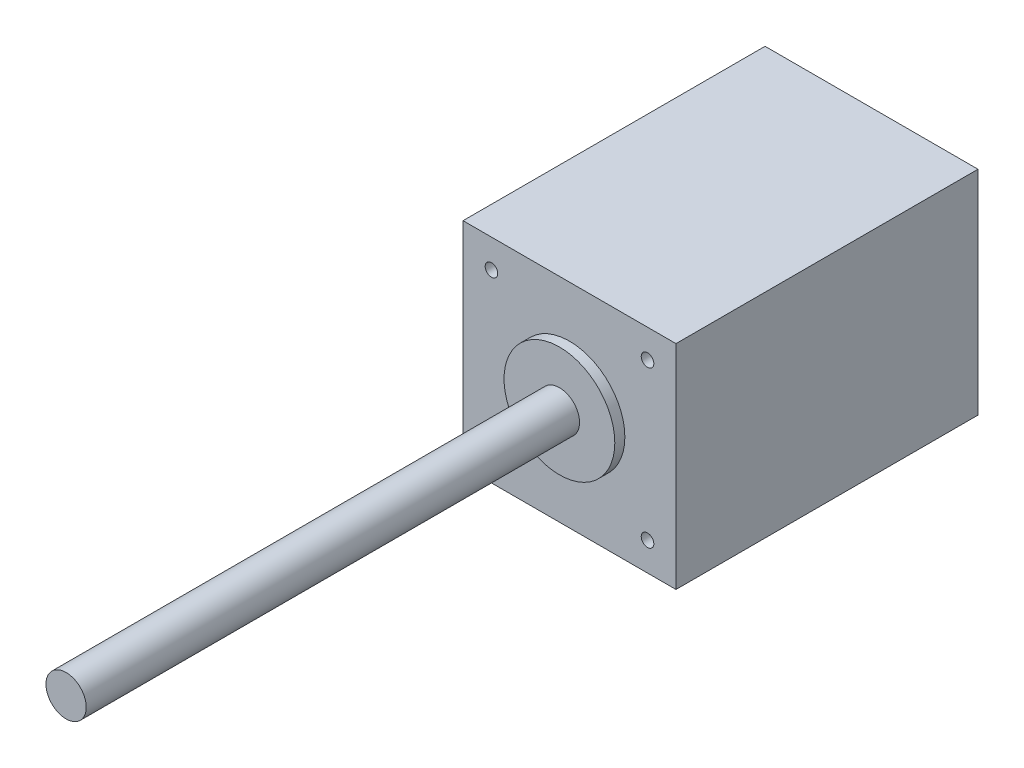
ISO-10303-21;
HEADER;
FILE_DESCRIPTION(('STEP AP214'),'2;1');
FILE_NAME('part.step','',(''),(''),'','','');
FILE_SCHEMA(('AUTOMOTIVE_DESIGN { 1 0 10303 214 1 1 1 1 }'));
ENDSEC;
DATA;
#1=APPLICATION_CONTEXT('core data for automotive mechanical design processes');
#2=APPLICATION_PROTOCOL_DEFINITION('international standard','automotive_design',2000,#1);
#3=PRODUCT_CONTEXT('',#1,'mechanical');
#4=PRODUCT('Part','Part','',(#3));
#5=PRODUCT_RELATED_PRODUCT_CATEGORY('part','',(#4));
#6=PRODUCT_DEFINITION_FORMATION('','',#4);
#7=PRODUCT_DEFINITION_CONTEXT('part definition',#1,'design');
#8=PRODUCT_DEFINITION('design','',#6,#7);
#9=PRODUCT_DEFINITION_SHAPE('','',#8);
#10=(LENGTH_UNIT() NAMED_UNIT(*) SI_UNIT(.MILLI.,.METRE.));
#11=(NAMED_UNIT(*) PLANE_ANGLE_UNIT() SI_UNIT($,.RADIAN.));
#12=(NAMED_UNIT(*) SI_UNIT($,.STERADIAN.) SOLID_ANGLE_UNIT());
#13=UNCERTAINTY_MEASURE_WITH_UNIT(LENGTH_MEASURE(1.E-05),#10,'distance_accuracy_value','');
#14=(GEOMETRIC_REPRESENTATION_CONTEXT(3) GLOBAL_UNCERTAINTY_ASSIGNED_CONTEXT((#13)) GLOBAL_UNIT_ASSIGNED_CONTEXT((#10,
#11,#12)) REPRESENTATION_CONTEXT('',''));
#15=CARTESIAN_POINT('',(0.,0.,0.));
#16=DIRECTION('',(0.,0.,1.));
#17=DIRECTION('',(1.,0.,0.));
#18=AXIS2_PLACEMENT_3D('',#15,#16,#17);
#19=CARTESIAN_POINT('',(-21.15,-21.15,60.));
#20=DIRECTION('',(1.,0.,0.));
#21=DIRECTION('',(0.,0.,-1.));
#22=AXIS2_PLACEMENT_3D('',#19,#20,#21);
#23=PLANE('',#22);
#24=DIRECTION('',(0.,-1.,0.));
#25=VECTOR('',#24,1.);
#26=CARTESIAN_POINT('',(-21.15,-21.15,0.));
#27=LINE('',#26,#25);
#28=CARTESIAN_POINT('',(-21.15,21.15,0.));
#29=VERTEX_POINT('',#28);
#30=CARTESIAN_POINT('',(-21.15,-21.15,0.));
#31=VERTEX_POINT('',#30);
#32=EDGE_CURVE('E116',#29,#31,#27,.T.);
#33=ORIENTED_EDGE('',*,*,#32,.T.);
#34=DIRECTION('',(0.,0.,-1.));
#35=VECTOR('',#34,1.);
#36=CARTESIAN_POINT('',(-21.15,-21.15,60.));
#37=LINE('',#36,#35);
#38=CARTESIAN_POINT('',(-21.15,-21.15,60.));
#39=VERTEX_POINT('',#38);
#40=EDGE_CURVE('E47',#39,#31,#37,.T.);
#41=ORIENTED_EDGE('',*,*,#40,.F.);
#42=DIRECTION('',(0.,-1.,0.));
#43=VECTOR('',#42,1.);
#44=CARTESIAN_POINT('',(-21.15,-21.15,60.));
#45=LINE('',#44,#43);
#46=CARTESIAN_POINT('',(-21.15,21.15,60.));
#47=VERTEX_POINT('',#46);
#48=EDGE_CURVE('E99',#47,#39,#45,.T.);
#49=ORIENTED_EDGE('',*,*,#48,.F.);
#50=DIRECTION('',(0.,0.,-1.));
#51=VECTOR('',#50,1.);
#52=CARTESIAN_POINT('',(-21.15,21.15,60.));
#53=LINE('',#52,#51);
#54=EDGE_CURVE('E112',#47,#29,#53,.T.);
#55=ORIENTED_EDGE('',*,*,#54,.T.);
#56=EDGE_LOOP('',(#33,#41,#49,#55));
#57=FACE_BOUND('',#56,.T.);
#58=ADVANCED_FACE('F44',(#57),#23,.F.);
#59=CARTESIAN_POINT('',(21.15,-21.15,60.));
#60=DIRECTION('',(0.,1.,0.));
#61=DIRECTION('',(-1.,0.,0.));
#62=AXIS2_PLACEMENT_3D('',#59,#60,#61);
#63=PLANE('',#62);
#64=DIRECTION('',(1.,0.,0.));
#65=VECTOR('',#64,1.);
#66=CARTESIAN_POINT('',(21.15,-21.15,0.));
#67=LINE('',#66,#65);
#68=CARTESIAN_POINT('',(21.15,-21.15,0.));
#69=VERTEX_POINT('',#68);
#70=EDGE_CURVE('E105',#31,#69,#67,.T.);
#71=ORIENTED_EDGE('',*,*,#70,.T.);
#72=DIRECTION('',(0.,0.,-1.));
#73=VECTOR('',#72,1.);
#74=CARTESIAN_POINT('',(21.15,-21.15,60.));
#75=LINE('',#74,#73);
#76=CARTESIAN_POINT('',(21.15,-21.15,60.));
#77=VERTEX_POINT('',#76);
#78=EDGE_CURVE('E103',#77,#69,#75,.T.);
#79=ORIENTED_EDGE('',*,*,#78,.F.);
#80=DIRECTION('',(1.,0.,0.));
#81=VECTOR('',#80,1.);
#82=CARTESIAN_POINT('',(21.15,-21.15,60.));
#83=LINE('',#82,#81);
#84=EDGE_CURVE('E94',#39,#77,#83,.T.);
#85=ORIENTED_EDGE('',*,*,#84,.F.);
#86=ORIENTED_EDGE('',*,*,#40,.T.);
#87=EDGE_LOOP('',(#71,#79,#85,#86));
#88=FACE_BOUND('',#87,.T.);
#89=ADVANCED_FACE('F104',(#88),#63,.F.);
#90=CARTESIAN_POINT('',(21.15,-21.15,60.));
#91=DIRECTION('',(-1.,0.,0.));
#92=DIRECTION('',(0.,0.,1.));
#93=AXIS2_PLACEMENT_3D('',#90,#91,#92);
#94=PLANE('',#93);
#95=DIRECTION('',(0.,1.,0.));
#96=VECTOR('',#95,1.);
#97=CARTESIAN_POINT('',(21.15,-21.15,0.));
#98=LINE('',#97,#96);
#99=CARTESIAN_POINT('',(21.15,21.15,0.));
#100=VERTEX_POINT('',#99);
#101=EDGE_CURVE('E80',#69,#100,#98,.T.);
#102=ORIENTED_EDGE('',*,*,#101,.T.);
#103=DIRECTION('',(0.,0.,-1.));
#104=VECTOR('',#103,1.);
#105=CARTESIAN_POINT('',(21.15,21.15,60.));
#106=LINE('',#105,#104);
#107=CARTESIAN_POINT('',(21.15,21.15,60.));
#108=VERTEX_POINT('',#107);
#109=EDGE_CURVE('E107',#108,#100,#106,.T.);
#110=ORIENTED_EDGE('',*,*,#109,.F.);
#111=DIRECTION('',(0.,1.,0.));
#112=VECTOR('',#111,1.);
#113=CARTESIAN_POINT('',(21.15,-21.15,60.));
#114=LINE('',#113,#112);
#115=EDGE_CURVE('E97',#77,#108,#114,.T.);
#116=ORIENTED_EDGE('',*,*,#115,.F.);
#117=ORIENTED_EDGE('',*,*,#78,.T.);
#118=EDGE_LOOP('',(#102,#110,#116,#117));
#119=FACE_BOUND('',#118,.T.);
#120=ADVANCED_FACE('F108',(#119),#94,.F.);
#121=CARTESIAN_POINT('',(21.15,21.15,60.));
#122=DIRECTION('',(0.,-1.,0.));
#123=DIRECTION('',(1.,0.,0.));
#124=AXIS2_PLACEMENT_3D('',#121,#122,#123);
#125=PLANE('',#124);
#126=DIRECTION('',(-1.,0.,0.));
#127=VECTOR('',#126,1.);
#128=CARTESIAN_POINT('',(21.15,21.15,0.));
#129=LINE('',#128,#127);
#130=EDGE_CURVE('E86',#100,#29,#129,.T.);
#131=ORIENTED_EDGE('',*,*,#130,.T.);
#132=ORIENTED_EDGE('',*,*,#54,.F.);
#133=DIRECTION('',(-1.,0.,0.));
#134=VECTOR('',#133,1.);
#135=CARTESIAN_POINT('',(21.15,21.15,60.));
#136=LINE('',#135,#134);
#137=EDGE_CURVE('E63',#108,#47,#136,.T.);
#138=ORIENTED_EDGE('',*,*,#137,.F.);
#139=ORIENTED_EDGE('',*,*,#109,.T.);
#140=EDGE_LOOP('',(#131,#132,#138,#139));
#141=FACE_BOUND('',#140,.T.);
#142=ADVANCED_FACE('F130',(#141),#125,.F.);
#143=CARTESIAN_POINT('',(0.,0.,60.));
#144=DIRECTION('',(0.,0.,1.));
#145=DIRECTION('',(1.,0.,0.));
#146=AXIS2_PLACEMENT_3D('',#143,#144,#145);
#147=PLANE('',#146);
#148=CARTESIAN_POINT('',(-15.5,15.5,60.));
#149=DIRECTION('',(0.,0.,1.));
#150=DIRECTION('',(1.,0.,0.));
#151=AXIS2_PLACEMENT_3D('',#148,#149,#150);
#152=CIRCLE('',#151,1.25);
#153=CARTESIAN_POINT('',(-14.25,15.5,60.));
#154=VERTEX_POINT('',#153);
#155=EDGE_CURVE('E175',#154,#154,#152,.T.);
#156=ORIENTED_EDGE('',*,*,#155,.F.);
#157=EDGE_LOOP('',(#156));
#158=FACE_BOUND('',#157,.T.);
#159=CARTESIAN_POINT('',(15.5,15.5,60.));
#160=DIRECTION('',(0.,0.,1.));
#161=DIRECTION('',(1.,0.,0.));
#162=AXIS2_PLACEMENT_3D('',#159,#160,#161);
#163=CIRCLE('',#162,1.25);
#164=CARTESIAN_POINT('',(16.75,15.5,60.));
#165=VERTEX_POINT('',#164);
#166=EDGE_CURVE('E167',#165,#165,#163,.T.);
#167=ORIENTED_EDGE('',*,*,#166,.F.);
#168=EDGE_LOOP('',(#167));
#169=FACE_BOUND('',#168,.T.);
#170=CARTESIAN_POINT('',(15.5,-15.5,60.));
#171=DIRECTION('',(0.,0.,1.));
#172=DIRECTION('',(1.,0.,0.));
#173=AXIS2_PLACEMENT_3D('',#170,#171,#172);
#174=CIRCLE('',#173,1.25);
#175=CARTESIAN_POINT('',(16.75,-15.5,60.));
#176=VERTEX_POINT('',#175);
#177=EDGE_CURVE('E159',#176,#176,#174,.T.);
#178=ORIENTED_EDGE('',*,*,#177,.F.);
#179=EDGE_LOOP('',(#178));
#180=FACE_BOUND('',#179,.T.);
#181=CARTESIAN_POINT('',(-15.5,-15.5,60.));
#182=DIRECTION('',(0.,0.,1.));
#183=DIRECTION('',(1.,0.,0.));
#184=AXIS2_PLACEMENT_3D('',#181,#182,#183);
#185=CIRCLE('',#184,1.25);
#186=CARTESIAN_POINT('',(-14.25,-15.5,60.));
#187=VERTEX_POINT('',#186);
#188=EDGE_CURVE('E151',#187,#187,#185,.T.);
#189=ORIENTED_EDGE('',*,*,#188,.F.);
#190=EDGE_LOOP('',(#189));
#191=FACE_BOUND('',#190,.T.);
#192=CARTESIAN_POINT('',(0.,0.,60.));
#193=DIRECTION('',(0.,0.,1.));
#194=DIRECTION('',(1.,0.,0.));
#195=AXIS2_PLACEMENT_3D('',#192,#193,#194);
#196=CIRCLE('',#195,11.);
#197=CARTESIAN_POINT('',(11.,0.,60.));
#198=VERTEX_POINT('',#197);
#199=EDGE_CURVE('E54',#198,#198,#196,.T.);
#200=ORIENTED_EDGE('',*,*,#199,.F.);
#201=EDGE_LOOP('',(#200));
#202=FACE_BOUND('',#201,.T.);
#203=ORIENTED_EDGE('',*,*,#48,.T.);
#204=ORIENTED_EDGE('',*,*,#84,.T.);
#205=ORIENTED_EDGE('',*,*,#115,.T.);
#206=ORIENTED_EDGE('',*,*,#137,.T.);
#207=EDGE_LOOP('',(#203,#204,#205,#206));
#208=FACE_BOUND('',#207,.T.);
#209=ADVANCED_FACE('F95',(#158,#169,#180,#191,#202,#208),#147,.T.);
#210=CARTESIAN_POINT('',(0.,0.,0.));
#211=DIRECTION('',(0.,0.,1.));
#212=DIRECTION('',(1.,0.,0.));
#213=AXIS2_PLACEMENT_3D('',#210,#211,#212);
#214=PLANE('',#213);
#215=CARTESIAN_POINT('',(-15.5,15.5,0.));
#216=DIRECTION('',(0.,0.,1.));
#217=DIRECTION('',(1.,0.,0.));
#218=AXIS2_PLACEMENT_3D('',#215,#216,#217);
#219=CIRCLE('',#218,1.24999999999999);
#220=CARTESIAN_POINT('',(-14.25,15.5,0.));
#221=VERTEX_POINT('',#220);
#222=EDGE_CURVE('E171',#221,#221,#219,.T.);
#223=ORIENTED_EDGE('',*,*,#222,.T.);
#224=EDGE_LOOP('',(#223));
#225=FACE_BOUND('',#224,.T.);
#226=CARTESIAN_POINT('',(15.5,15.5,0.));
#227=DIRECTION('',(0.,0.,1.));
#228=DIRECTION('',(1.,0.,0.));
#229=AXIS2_PLACEMENT_3D('',#226,#227,#228);
#230=CIRCLE('',#229,1.24999999999999);
#231=CARTESIAN_POINT('',(16.75,15.5,0.));
#232=VERTEX_POINT('',#231);
#233=EDGE_CURVE('E163',#232,#232,#230,.T.);
#234=ORIENTED_EDGE('',*,*,#233,.T.);
#235=EDGE_LOOP('',(#234));
#236=FACE_BOUND('',#235,.T.);
#237=CARTESIAN_POINT('',(15.5,-15.5,0.));
#238=DIRECTION('',(0.,0.,1.));
#239=DIRECTION('',(1.,0.,0.));
#240=AXIS2_PLACEMENT_3D('',#237,#238,#239);
#241=CIRCLE('',#240,1.24999999999999);
#242=CARTESIAN_POINT('',(16.75,-15.5,0.));
#243=VERTEX_POINT('',#242);
#244=EDGE_CURVE('E155',#243,#243,#241,.T.);
#245=ORIENTED_EDGE('',*,*,#244,.T.);
#246=EDGE_LOOP('',(#245));
#247=FACE_BOUND('',#246,.T.);
#248=CARTESIAN_POINT('',(-15.5,-15.5,0.));
#249=DIRECTION('',(0.,0.,1.));
#250=DIRECTION('',(1.,0.,0.));
#251=AXIS2_PLACEMENT_3D('',#248,#249,#250);
#252=CIRCLE('',#251,1.24999999999999);
#253=CARTESIAN_POINT('',(-14.25,-15.5,0.));
#254=VERTEX_POINT('',#253);
#255=EDGE_CURVE('E147',#254,#254,#252,.T.);
#256=ORIENTED_EDGE('',*,*,#255,.T.);
#257=EDGE_LOOP('',(#256));
#258=FACE_BOUND('',#257,.T.);
#259=ORIENTED_EDGE('',*,*,#32,.F.);
#260=ORIENTED_EDGE('',*,*,#130,.F.);
#261=ORIENTED_EDGE('',*,*,#101,.F.);
#262=ORIENTED_EDGE('',*,*,#70,.F.);
#263=EDGE_LOOP('',(#259,#260,#261,#262));
#264=FACE_BOUND('',#263,.T.);
#265=ADVANCED_FACE('F133',(#225,#236,#247,#258,#264),#214,.F.);
#266=CARTESIAN_POINT('',(0.,0.,62.));
#267=DIRECTION('',(0.,0.,-1.));
#268=DIRECTION('',(-1.,0.,0.));
#269=AXIS2_PLACEMENT_3D('',#266,#267,#268);
#270=CYLINDRICAL_SURFACE('',#269,11.);
#271=CARTESIAN_POINT('',(0.,0.,62.));
#272=DIRECTION('',(0.,0.,1.));
#273=DIRECTION('',(1.,0.,0.));
#274=AXIS2_PLACEMENT_3D('',#271,#272,#273);
#275=CIRCLE('',#274,11.);
#276=CARTESIAN_POINT('',(11.,0.,62.));
#277=VERTEX_POINT('',#276);
#278=EDGE_CURVE('E120',#277,#277,#275,.T.);
#279=ORIENTED_EDGE('',*,*,#278,.F.);
#280=EDGE_LOOP('',(#279));
#281=FACE_BOUND('',#280,.T.);
#282=ORIENTED_EDGE('',*,*,#199,.T.);
#283=EDGE_LOOP('',(#282));
#284=FACE_BOUND('',#283,.T.);
#285=ADVANCED_FACE('F193',(#281,#284),#270,.T.);
#286=CARTESIAN_POINT('',(0.,0.,62.));
#287=DIRECTION('',(0.,0.,1.));
#288=DIRECTION('',(1.,0.,0.));
#289=AXIS2_PLACEMENT_3D('',#286,#287,#288);
#290=PLANE('',#289);
#291=CARTESIAN_POINT('',(0.,0.,62.));
#292=DIRECTION('',(0.,0.,1.));
#293=DIRECTION('',(1.,0.,0.));
#294=AXIS2_PLACEMENT_3D('',#291,#292,#293);
#295=CIRCLE('',#294,4.);
#296=CARTESIAN_POINT('',(4.,0.,62.));
#297=VERTEX_POINT('',#296);
#298=EDGE_CURVE('E11',#297,#297,#295,.T.);
#299=ORIENTED_EDGE('',*,*,#298,.F.);
#300=EDGE_LOOP('',(#299));
#301=FACE_BOUND('',#300,.T.);
#302=ORIENTED_EDGE('',*,*,#278,.T.);
#303=EDGE_LOOP('',(#302));
#304=FACE_BOUND('',#303,.T.);
#305=ADVANCED_FACE('F195',(#301,#304),#290,.T.);
#306=CARTESIAN_POINT('',(0.,0.,160.));
#307=DIRECTION('',(0.,0.,-1.));
#308=DIRECTION('',(-1.,0.,0.));
#309=AXIS2_PLACEMENT_3D('',#306,#307,#308);
#310=CYLINDRICAL_SURFACE('',#309,4.);
#311=CARTESIAN_POINT('',(0.,0.,160.));
#312=DIRECTION('',(0.,0.,1.));
#313=DIRECTION('',(1.,0.,0.));
#314=AXIS2_PLACEMENT_3D('',#311,#312,#313);
#315=CIRCLE('',#314,4.);
#316=CARTESIAN_POINT('',(4.,0.,160.));
#317=VERTEX_POINT('',#316);
#318=EDGE_CURVE('E142',#317,#317,#315,.T.);
#319=ORIENTED_EDGE('',*,*,#318,.F.);
#320=EDGE_LOOP('',(#319));
#321=FACE_BOUND('',#320,.T.);
#322=ORIENTED_EDGE('',*,*,#298,.T.);
#323=EDGE_LOOP('',(#322));
#324=FACE_BOUND('',#323,.T.);
#325=ADVANCED_FACE('F202',(#321,#324),#310,.T.);
#326=CARTESIAN_POINT('',(0.,0.,160.));
#327=DIRECTION('',(0.,0.,1.));
#328=DIRECTION('',(1.,0.,0.));
#329=AXIS2_PLACEMENT_3D('',#326,#327,#328);
#330=PLANE('',#329);
#331=ORIENTED_EDGE('',*,*,#318,.T.);
#332=EDGE_LOOP('',(#331));
#333=FACE_BOUND('',#332,.T.);
#334=ADVANCED_FACE('F245',(#333),#330,.T.);
#335=CARTESIAN_POINT('',(-15.5,-15.5,60.));
#336=DIRECTION('',(0.,0.,1.));
#337=DIRECTION('',(1.,0.,0.));
#338=AXIS2_PLACEMENT_3D('',#335,#336,#337);
#339=CYLINDRICAL_SURFACE('',#338,1.24999999999999);
#340=ORIENTED_EDGE('',*,*,#255,.F.);
#341=EDGE_LOOP('',(#340));
#342=FACE_BOUND('',#341,.T.);
#343=ORIENTED_EDGE('',*,*,#188,.T.);
#344=EDGE_LOOP('',(#343));
#345=FACE_BOUND('',#344,.T.);
#346=ADVANCED_FACE('F238',(#342,#345),#339,.F.);
#347=CARTESIAN_POINT('',(15.5,-15.5,60.));
#348=DIRECTION('',(0.,0.,1.));
#349=DIRECTION('',(1.,0.,0.));
#350=AXIS2_PLACEMENT_3D('',#347,#348,#349);
#351=CYLINDRICAL_SURFACE('',#350,1.24999999999999);
#352=ORIENTED_EDGE('',*,*,#244,.F.);
#353=EDGE_LOOP('',(#352));
#354=FACE_BOUND('',#353,.T.);
#355=ORIENTED_EDGE('',*,*,#177,.T.);
#356=EDGE_LOOP('',(#355));
#357=FACE_BOUND('',#356,.T.);
#358=ADVANCED_FACE('F244',(#354,#357),#351,.F.);
#359=CARTESIAN_POINT('',(15.5,15.5,60.));
#360=DIRECTION('',(0.,0.,1.));
#361=DIRECTION('',(1.,0.,0.));
#362=AXIS2_PLACEMENT_3D('',#359,#360,#361);
#363=CYLINDRICAL_SURFACE('',#362,1.24999999999999);
#364=ORIENTED_EDGE('',*,*,#233,.F.);
#365=EDGE_LOOP('',(#364));
#366=FACE_BOUND('',#365,.T.);
#367=ORIENTED_EDGE('',*,*,#166,.T.);
#368=EDGE_LOOP('',(#367));
#369=FACE_BOUND('',#368,.T.);
#370=ADVANCED_FACE('F258',(#366,#369),#363,.F.);
#371=CARTESIAN_POINT('',(-15.5,15.5,60.));
#372=DIRECTION('',(0.,0.,1.));
#373=DIRECTION('',(1.,0.,0.));
#374=AXIS2_PLACEMENT_3D('',#371,#372,#373);
#375=CYLINDRICAL_SURFACE('',#374,1.24999999999999);
#376=ORIENTED_EDGE('',*,*,#222,.F.);
#377=EDGE_LOOP('',(#376));
#378=FACE_BOUND('',#377,.T.);
#379=ORIENTED_EDGE('',*,*,#155,.T.);
#380=EDGE_LOOP('',(#379));
#381=FACE_BOUND('',#380,.T.);
#382=ADVANCED_FACE('F180',(#378,#381),#375,.F.);
#383=CLOSED_SHELL('',(#58,#89,#120,#142,#209,#265,#285,#305,#325,#334,#346,#358,#370,#382));
#384=MANIFOLD_SOLID_BREP('B2',#383);
#385=ADVANCED_BREP_SHAPE_REPRESENTATION('',(#18,#384),#14);
#386=SHAPE_DEFINITION_REPRESENTATION(#9,#385);
ENDSEC;
END-ISO-10303-21;
